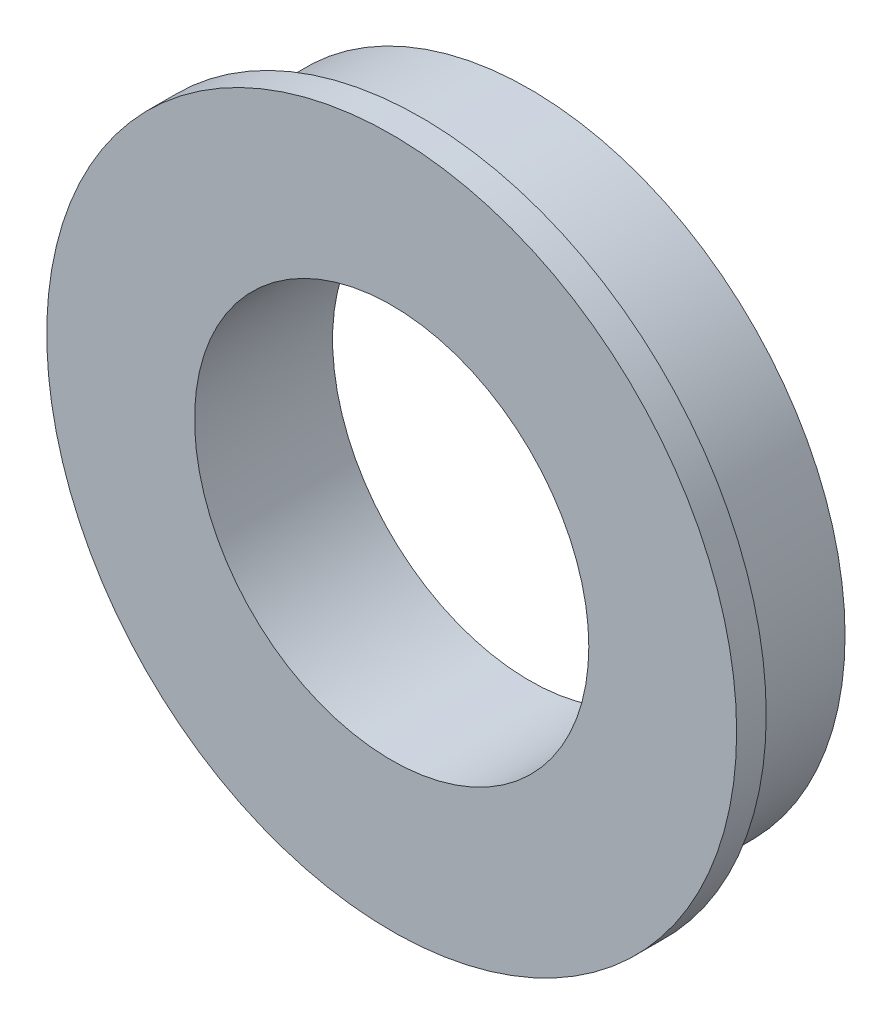
ISO-10303-21;
HEADER;
FILE_DESCRIPTION(('STEP AP214'),'2;1');
FILE_NAME('part.step','',(''),(''),'','','');
FILE_SCHEMA(('AUTOMOTIVE_DESIGN { 1 0 10303 214 1 1 1 1 }'));
ENDSEC;
DATA;
#1=APPLICATION_CONTEXT('core data for automotive mechanical design processes');
#2=APPLICATION_PROTOCOL_DEFINITION('international standard','automotive_design',2000,#1);
#3=PRODUCT_CONTEXT('',#1,'mechanical');
#4=PRODUCT('Part','Part','',(#3));
#5=PRODUCT_RELATED_PRODUCT_CATEGORY('part','',(#4));
#6=PRODUCT_DEFINITION_FORMATION('','',#4);
#7=PRODUCT_DEFINITION_CONTEXT('part definition',#1,'design');
#8=PRODUCT_DEFINITION('design','',#6,#7);
#9=PRODUCT_DEFINITION_SHAPE('','',#8);
#10=(LENGTH_UNIT() NAMED_UNIT(*) SI_UNIT(.MILLI.,.METRE.));
#11=(NAMED_UNIT(*) PLANE_ANGLE_UNIT() SI_UNIT($,.RADIAN.));
#12=(NAMED_UNIT(*) SI_UNIT($,.STERADIAN.) SOLID_ANGLE_UNIT());
#13=UNCERTAINTY_MEASURE_WITH_UNIT(LENGTH_MEASURE(1.E-05),#10,'distance_accuracy_value','');
#14=(GEOMETRIC_REPRESENTATION_CONTEXT(3) GLOBAL_UNCERTAINTY_ASSIGNED_CONTEXT((#13)) GLOBAL_UNIT_ASSIGNED_CONTEXT((#10,
#11,#12)) REPRESENTATION_CONTEXT('',''));
#15=CARTESIAN_POINT('',(0.,0.,0.));
#16=DIRECTION('',(0.,0.,1.));
#17=DIRECTION('',(1.,0.,0.));
#18=AXIS2_PLACEMENT_3D('',#15,#16,#17);
#19=CARTESIAN_POINT('',(0.,0.,0.));
#20=DIRECTION('',(0.,0.,1.));
#21=DIRECTION('',(1.,0.,0.));
#22=AXIS2_PLACEMENT_3D('',#19,#20,#21);
#23=PLANE('',#22);
#24=CARTESIAN_POINT('',(0.,0.,0.));
#25=DIRECTION('',(0.,0.,1.));
#26=DIRECTION('',(1.,0.,0.));
#27=AXIS2_PLACEMENT_3D('',#24,#25,#26);
#28=CIRCLE('',#27,16.);
#29=CARTESIAN_POINT('',(16.,0.,0.));
#30=VERTEX_POINT('',#29);
#31=EDGE_CURVE('E41',#30,#30,#28,.T.);
#32=ORIENTED_EDGE('',*,*,#31,.F.);
#33=EDGE_LOOP('',(#32));
#34=FACE_BOUND('',#33,.T.);
#35=CARTESIAN_POINT('',(0.,0.,0.));
#36=DIRECTION('',(0.,0.,1.));
#37=DIRECTION('',(1.,0.,0.));
#38=AXIS2_PLACEMENT_3D('',#35,#36,#37);
#39=CIRCLE('',#38,10.);
#40=CARTESIAN_POINT('',(10.,0.,0.));
#41=VERTEX_POINT('',#40);
#42=EDGE_CURVE('E48',#41,#41,#39,.T.);
#43=ORIENTED_EDGE('',*,*,#42,.T.);
#44=EDGE_LOOP('',(#43));
#45=FACE_BOUND('',#44,.T.);
#46=ADVANCED_FACE('F37',(#34,#45),#23,.F.);
#47=CARTESIAN_POINT('',(0.,0.,5.5));
#48=DIRECTION('',(0.,0.,-1.));
#49=DIRECTION('',(-1.,0.,0.));
#50=AXIS2_PLACEMENT_3D('',#47,#48,#49);
#51=CYLINDRICAL_SURFACE('',#50,16.);
#52=CARTESIAN_POINT('',(0.,0.,5.5));
#53=DIRECTION('',(0.,0.,1.));
#54=DIRECTION('',(1.,0.,0.));
#55=AXIS2_PLACEMENT_3D('',#52,#53,#54);
#56=CIRCLE('',#55,16.);
#57=CARTESIAN_POINT('',(16.,0.,5.5));
#58=VERTEX_POINT('',#57);
#59=EDGE_CURVE('E10',#58,#58,#56,.T.);
#60=ORIENTED_EDGE('',*,*,#59,.F.);
#61=EDGE_LOOP('',(#60));
#62=FACE_BOUND('',#61,.T.);
#63=ORIENTED_EDGE('',*,*,#31,.T.);
#64=EDGE_LOOP('',(#63));
#65=FACE_BOUND('',#64,.T.);
#66=ADVANCED_FACE('F39',(#62,#65),#51,.T.);
#67=CARTESIAN_POINT('',(0.,0.,5.5));
#68=DIRECTION('',(0.,0.,-1.));
#69=DIRECTION('',(-1.,0.,0.));
#70=AXIS2_PLACEMENT_3D('',#67,#68,#69);
#71=CYLINDRICAL_SURFACE('',#70,10.);
#72=ORIENTED_EDGE('',*,*,#42,.F.);
#73=EDGE_LOOP('',(#72));
#74=FACE_BOUND('',#73,.T.);
#75=CARTESIAN_POINT('',(0.,0.,7.));
#76=DIRECTION('',(0.,0.,1.));
#77=DIRECTION('',(1.,0.,0.));
#78=AXIS2_PLACEMENT_3D('',#75,#76,#77);
#79=CIRCLE('',#78,10.);
#80=CARTESIAN_POINT('',(10.,0.,7.));
#81=VERTEX_POINT('',#80);
#82=EDGE_CURVE('E56',#81,#81,#79,.T.);
#83=ORIENTED_EDGE('',*,*,#82,.T.);
#84=EDGE_LOOP('',(#83));
#85=FACE_BOUND('',#84,.T.);
#86=ADVANCED_FACE('F62',(#74,#85),#71,.F.);
#87=CARTESIAN_POINT('',(0.,0.,7.));
#88=DIRECTION('',(0.,0.,1.));
#89=DIRECTION('',(1.,0.,0.));
#90=AXIS2_PLACEMENT_3D('',#87,#88,#89);
#91=PLANE('',#90);
#92=CARTESIAN_POINT('',(0.,0.,7.));
#93=DIRECTION('',(0.,0.,1.));
#94=DIRECTION('',(1.,0.,0.));
#95=AXIS2_PLACEMENT_3D('',#92,#93,#94);
#96=CIRCLE('',#95,17.5);
#97=CARTESIAN_POINT('',(17.5,0.,7.));
#98=VERTEX_POINT('',#97);
#99=EDGE_CURVE('E52',#98,#98,#96,.T.);
#100=ORIENTED_EDGE('',*,*,#99,.T.);
#101=EDGE_LOOP('',(#100));
#102=FACE_BOUND('',#101,.T.);
#103=ORIENTED_EDGE('',*,*,#82,.F.);
#104=EDGE_LOOP('',(#103));
#105=FACE_BOUND('',#104,.T.);
#106=ADVANCED_FACE('F64',(#102,#105),#91,.T.);
#107=CARTESIAN_POINT('',(0.,0.,5.5));
#108=DIRECTION('',(0.,0.,1.));
#109=DIRECTION('',(1.,0.,0.));
#110=AXIS2_PLACEMENT_3D('',#107,#108,#109);
#111=PLANE('',#110);
#112=ORIENTED_EDGE('',*,*,#59,.T.);
#113=EDGE_LOOP('',(#112));
#114=FACE_BOUND('',#113,.T.);
#115=CARTESIAN_POINT('',(0.,0.,5.5));
#116=DIRECTION('',(0.,0.,1.));
#117=DIRECTION('',(1.,0.,0.));
#118=AXIS2_PLACEMENT_3D('',#115,#116,#117);
#119=CIRCLE('',#118,17.5);
#120=CARTESIAN_POINT('',(17.5,0.,5.5));
#121=VERTEX_POINT('',#120);
#122=EDGE_CURVE('E53',#121,#121,#119,.T.);
#123=ORIENTED_EDGE('',*,*,#122,.F.);
#124=EDGE_LOOP('',(#123));
#125=FACE_BOUND('',#124,.T.);
#126=ADVANCED_FACE('F66',(#114,#125),#111,.F.);
#127=CARTESIAN_POINT('',(0.,0.,7.));
#128=DIRECTION('',(0.,0.,-1.));
#129=DIRECTION('',(-1.,0.,0.));
#130=AXIS2_PLACEMENT_3D('',#127,#128,#129);
#131=CYLINDRICAL_SURFACE('',#130,17.5);
#132=ORIENTED_EDGE('',*,*,#99,.F.);
#133=EDGE_LOOP('',(#132));
#134=FACE_BOUND('',#133,.T.);
#135=ORIENTED_EDGE('',*,*,#122,.T.);
#136=EDGE_LOOP('',(#135));
#137=FACE_BOUND('',#136,.T.);
#138=ADVANCED_FACE('F73',(#134,#137),#131,.T.);
#139=CLOSED_SHELL('',(#46,#66,#86,#106,#126,#138));
#140=MANIFOLD_SOLID_BREP('B2',#139);
#141=ADVANCED_BREP_SHAPE_REPRESENTATION('',(#18,#140),#14);
#142=SHAPE_DEFINITION_REPRESENTATION(#9,#141);
ENDSEC;
END-ISO-10303-21;
